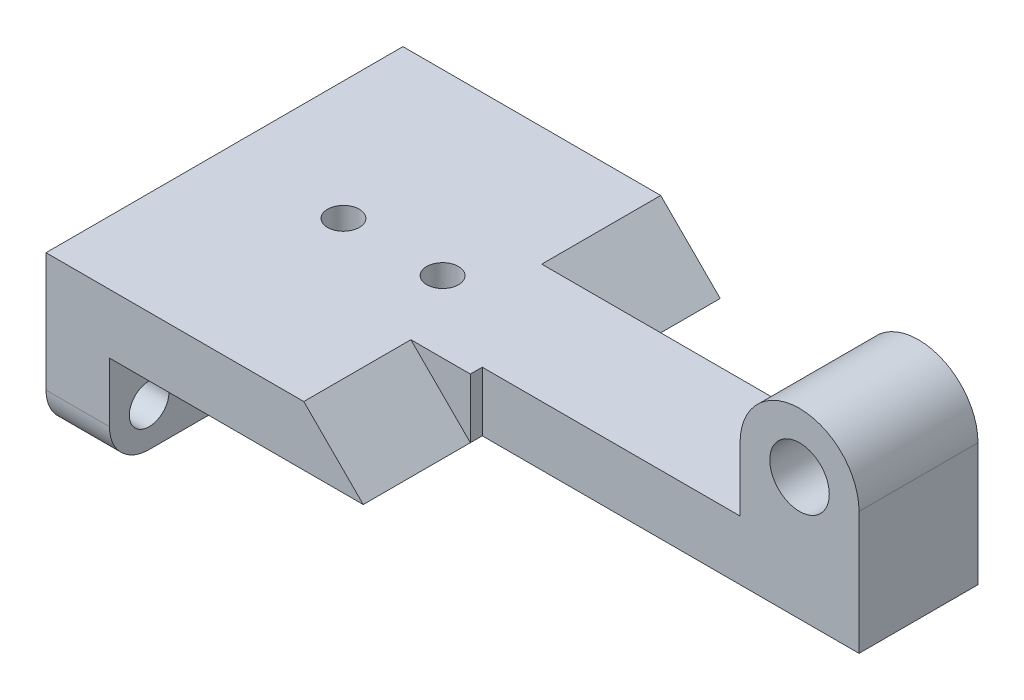
ISO-10303-21;
HEADER;
FILE_DESCRIPTION(('STEP AP214'),'2;1');
FILE_NAME('part.step','',(''),(''),'','','');
FILE_SCHEMA(('AUTOMOTIVE_DESIGN { 1 0 10303 214 1 1 1 1 }'));
ENDSEC;
DATA;
#1=APPLICATION_CONTEXT('core data for automotive mechanical design processes');
#2=APPLICATION_PROTOCOL_DEFINITION('international standard','automotive_design',2000,#1);
#3=PRODUCT_CONTEXT('',#1,'mechanical');
#4=PRODUCT('Part','Part','',(#3));
#5=PRODUCT_RELATED_PRODUCT_CATEGORY('part','',(#4));
#6=PRODUCT_DEFINITION_FORMATION('','',#4);
#7=PRODUCT_DEFINITION_CONTEXT('part definition',#1,'design');
#8=PRODUCT_DEFINITION('design','',#6,#7);
#9=PRODUCT_DEFINITION_SHAPE('','',#8);
#10=(LENGTH_UNIT() NAMED_UNIT(*) SI_UNIT(.MILLI.,.METRE.));
#11=(NAMED_UNIT(*) PLANE_ANGLE_UNIT() SI_UNIT($,.RADIAN.));
#12=(NAMED_UNIT(*) SI_UNIT($,.STERADIAN.) SOLID_ANGLE_UNIT());
#13=UNCERTAINTY_MEASURE_WITH_UNIT(LENGTH_MEASURE(1.E-05),#10,'distance_accuracy_value','');
#14=(GEOMETRIC_REPRESENTATION_CONTEXT(3) GLOBAL_UNCERTAINTY_ASSIGNED_CONTEXT((#13)) GLOBAL_UNIT_ASSIGNED_CONTEXT((#10,
#11,#12)) REPRESENTATION_CONTEXT('',''));
#15=CARTESIAN_POINT('',(0.,0.,0.));
#16=DIRECTION('',(0.,0.,1.));
#17=DIRECTION('',(1.,0.,0.));
#18=AXIS2_PLACEMENT_3D('',#15,#16,#17);
#19=CARTESIAN_POINT('',(0.,0.,45.));
#20=DIRECTION('',(1.,0.,0.));
#21=DIRECTION('',(0.,1.,0.));
#22=AXIS2_PLACEMENT_3D('',#19,#20,#21);
#23=PLANE('',#22);
#24=CARTESIAN_POINT('',(0.,-15.,-35.));
#25=DIRECTION('',(-1.,0.,0.));
#26=DIRECTION('',(0.,-1.,0.));
#27=AXIS2_PLACEMENT_3D('',#24,#25,#26);
#28=CIRCLE('',#27,5.);
#29=CARTESIAN_POINT('',(0.,-20.,-35.));
#30=VERTEX_POINT('',#29);
#31=EDGE_CURVE('E342',#30,#30,#28,.F.);
#32=ORIENTED_EDGE('',*,*,#31,.T.);
#33=EDGE_LOOP('',(#32));
#34=FACE_BOUND('',#33,.T.);
#35=CARTESIAN_POINT('',(0.,-15.,35.));
#36=DIRECTION('',(-1.,0.,0.));
#37=DIRECTION('',(0.,-1.,0.));
#38=AXIS2_PLACEMENT_3D('',#35,#36,#37);
#39=CIRCLE('',#38,5.);
#40=CARTESIAN_POINT('',(0.,-20.,35.));
#41=VERTEX_POINT('',#40);
#42=EDGE_CURVE('E338',#41,#41,#39,.T.);
#43=ORIENTED_EDGE('',*,*,#42,.F.);
#44=EDGE_LOOP('',(#43));
#45=FACE_BOUND('',#44,.T.);
#46=DIRECTION('',(0.,0.,-1.));
#47=VECTOR('',#46,1.);
#48=CARTESIAN_POINT('',(0.,-25.,45.));
#49=LINE('',#48,#47);
#50=CARTESIAN_POINT('',(0.,-25.,35.));
#51=VERTEX_POINT('',#50);
#52=CARTESIAN_POINT('',(0.,-25.,-35.));
#53=VERTEX_POINT('',#52);
#54=EDGE_CURVE('E187',#51,#53,#49,.T.);
#55=ORIENTED_EDGE('',*,*,#54,.F.);
#56=CARTESIAN_POINT('',(0.,-15.,35.));
#57=DIRECTION('',(-1.,0.,0.));
#58=DIRECTION('',(0.,-1.,0.));
#59=AXIS2_PLACEMENT_3D('',#56,#57,#58);
#60=CIRCLE('',#59,10.);
#61=CARTESIAN_POINT('',(0.,-15.,45.));
#62=VERTEX_POINT('',#61);
#63=EDGE_CURVE('E348',#51,#62,#60,.T.);
#64=ORIENTED_EDGE('',*,*,#63,.T.);
#65=DIRECTION('',(0.,-1.,0.));
#66=VECTOR('',#65,1.);
#67=CARTESIAN_POINT('',(0.,0.,45.));
#68=LINE('',#67,#66);
#69=CARTESIAN_POINT('',(0.,15.,45.));
#70=VERTEX_POINT('',#69);
#71=EDGE_CURVE('E317',#70,#62,#68,.T.);
#72=ORIENTED_EDGE('',*,*,#71,.F.);
#73=DIRECTION('',(0.,0.,-1.));
#74=VECTOR('',#73,1.);
#75=CARTESIAN_POINT('',(0.,15.,45.));
#76=LINE('',#75,#74);
#77=CARTESIAN_POINT('',(0.,15.,-45.));
#78=VERTEX_POINT('',#77);
#79=EDGE_CURVE('E198',#70,#78,#76,.T.);
#80=ORIENTED_EDGE('',*,*,#79,.T.);
#81=DIRECTION('',(0.,-1.,0.));
#82=VECTOR('',#81,1.);
#83=CARTESIAN_POINT('',(0.,0.,-45.));
#84=LINE('',#83,#82);
#85=CARTESIAN_POINT('',(0.,-15.,-45.));
#86=VERTEX_POINT('',#85);
#87=EDGE_CURVE('E307',#78,#86,#84,.T.);
#88=ORIENTED_EDGE('',*,*,#87,.T.);
#89=CARTESIAN_POINT('',(0.,-15.,-35.));
#90=DIRECTION('',(-1.,0.,0.));
#91=DIRECTION('',(0.,-1.,0.));
#92=AXIS2_PLACEMENT_3D('',#89,#90,#91);
#93=CIRCLE('',#92,10.);
#94=EDGE_CURVE('E86',#53,#86,#93,.F.);
#95=ORIENTED_EDGE('',*,*,#94,.F.);
#96=EDGE_LOOP('',(#55,#64,#72,#80,#88,#95));
#97=FACE_BOUND('',#96,.T.);
#98=ADVANCED_FACE('F62',(#34,#45,#97),#23,.F.);
#99=CARTESIAN_POINT('',(0.,-25.,45.));
#100=DIRECTION('',(0.,1.,0.));
#101=DIRECTION('',(0.,0.,1.));
#102=AXIS2_PLACEMENT_3D('',#99,#100,#101);
#103=PLANE('',#102);
#104=DIRECTION('',(0.,0.,-1.));
#105=VECTOR('',#104,1.);
#106=CARTESIAN_POINT('',(16.,-25.,45.));
#107=LINE('',#106,#105);
#108=CARTESIAN_POINT('',(16.,-25.,35.));
#109=VERTEX_POINT('',#108);
#110=CARTESIAN_POINT('',(16.,-25.,-35.));
#111=VERTEX_POINT('',#110);
#112=EDGE_CURVE('E190',#109,#111,#107,.T.);
#113=ORIENTED_EDGE('',*,*,#112,.F.);
#114=DIRECTION('',(-1.,0.,0.));
#115=VECTOR('',#114,1.);
#116=CARTESIAN_POINT('',(175.001,-25.,35.));
#117=LINE('',#116,#115);
#118=EDGE_CURVE('E346',#109,#51,#117,.T.);
#119=ORIENTED_EDGE('',*,*,#118,.T.);
#120=ORIENTED_EDGE('',*,*,#54,.T.);
#121=DIRECTION('',(-1.,0.,0.));
#122=VECTOR('',#121,1.);
#123=CARTESIAN_POINT('',(175.001,-25.,-35.));
#124=LINE('',#123,#122);
#125=EDGE_CURVE('E179',#111,#53,#124,.T.);
#126=ORIENTED_EDGE('',*,*,#125,.F.);
#127=EDGE_LOOP('',(#113,#119,#120,#126));
#128=FACE_BOUND('',#127,.T.);
#129=ADVANCED_FACE('F189',(#128),#103,.F.);
#130=CARTESIAN_POINT('',(16.,0.,45.));
#131=DIRECTION('',(-1.,0.,0.));
#132=DIRECTION('',(0.,0.,1.));
#133=AXIS2_PLACEMENT_3D('',#130,#131,#132);
#134=PLANE('',#133);
#135=CARTESIAN_POINT('',(16.,-15.,-35.));
#136=DIRECTION('',(-1.,0.,0.));
#137=DIRECTION('',(0.,0.,1.));
#138=AXIS2_PLACEMENT_3D('',#135,#136,#137);
#139=CIRCLE('',#138,5.);
#140=CARTESIAN_POINT('',(16.,-15.,-30.));
#141=VERTEX_POINT('',#140);
#142=EDGE_CURVE('E182',#141,#141,#139,.T.);
#143=ORIENTED_EDGE('',*,*,#142,.T.);
#144=EDGE_LOOP('',(#143));
#145=FACE_BOUND('',#144,.T.);
#146=CARTESIAN_POINT('',(16.,-15.,35.));
#147=DIRECTION('',(-1.,0.,0.));
#148=DIRECTION('',(0.,0.,1.));
#149=AXIS2_PLACEMENT_3D('',#146,#147,#148);
#150=CIRCLE('',#149,5.);
#151=CARTESIAN_POINT('',(16.,-15.,40.));
#152=VERTEX_POINT('',#151);
#153=EDGE_CURVE('E335',#152,#152,#150,.F.);
#154=ORIENTED_EDGE('',*,*,#153,.F.);
#155=EDGE_LOOP('',(#154));
#156=FACE_BOUND('',#155,.T.);
#157=DIRECTION('',(0.,1.,0.));
#158=VECTOR('',#157,1.);
#159=CARTESIAN_POINT('',(16.,0.,45.));
#160=LINE('',#159,#158);
#161=CARTESIAN_POINT('',(16.,-15.,45.));
#162=VERTEX_POINT('',#161);
#163=CARTESIAN_POINT('',(16.,0.,45.));
#164=VERTEX_POINT('',#163);
#165=EDGE_CURVE('E320',#162,#164,#160,.T.);
#166=ORIENTED_EDGE('',*,*,#165,.F.);
#167=CARTESIAN_POINT('',(16.,-15.,35.));
#168=DIRECTION('',(-1.,0.,0.));
#169=DIRECTION('',(0.,0.,1.));
#170=AXIS2_PLACEMENT_3D('',#167,#168,#169);
#171=CIRCLE('',#170,10.);
#172=EDGE_CURVE('E77',#162,#109,#171,.F.);
#173=ORIENTED_EDGE('',*,*,#172,.T.);
#174=ORIENTED_EDGE('',*,*,#112,.T.);
#175=CARTESIAN_POINT('',(16.,-15.,-35.));
#176=DIRECTION('',(-1.,0.,0.));
#177=DIRECTION('',(0.,0.,1.));
#178=AXIS2_PLACEMENT_3D('',#175,#176,#177);
#179=CIRCLE('',#178,10.);
#180=CARTESIAN_POINT('',(16.,-15.,-45.));
#181=VERTEX_POINT('',#180);
#182=EDGE_CURVE('E175',#181,#111,#179,.T.);
#183=ORIENTED_EDGE('',*,*,#182,.F.);
#184=DIRECTION('',(0.,1.,0.));
#185=VECTOR('',#184,1.);
#186=CARTESIAN_POINT('',(16.,0.,-45.));
#187=LINE('',#186,#185);
#188=CARTESIAN_POINT('',(16.,0.,-45.));
#189=VERTEX_POINT('',#188);
#190=EDGE_CURVE('E302',#181,#189,#187,.T.);
#191=ORIENTED_EDGE('',*,*,#190,.T.);
#192=DIRECTION('',(0.,0.,-1.));
#193=VECTOR('',#192,1.);
#194=CARTESIAN_POINT('',(16.,0.,45.));
#195=LINE('',#194,#193);
#196=EDGE_CURVE('E193',#164,#189,#195,.T.);
#197=ORIENTED_EDGE('',*,*,#196,.F.);
#198=EDGE_LOOP('',(#166,#173,#174,#183,#191,#197));
#199=FACE_BOUND('',#198,.T.);
#200=ADVANCED_FACE('F195',(#145,#156,#199),#134,.F.);
#201=CARTESIAN_POINT('',(175.,-1.5668470105597E-13,15.));
#202=DIRECTION('',(-1.,0.,0.));
#203=DIRECTION('',(0.,-1.,0.));
#204=AXIS2_PLACEMENT_3D('',#201,#202,#203);
#205=PLANE('',#204);
#206=DIRECTION('',(0.,1.,0.));
#207=VECTOR('',#206,1.);
#208=CARTESIAN_POINT('',(175.,-1.5668470105597E-13,-15.));
#209=LINE('',#208,#207);
#210=CARTESIAN_POINT('',(175.,0.,-15.));
#211=VERTEX_POINT('',#210);
#212=CARTESIAN_POINT('',(175.,31.,-15.));
#213=VERTEX_POINT('',#212);
#214=EDGE_CURVE('E246',#211,#213,#209,.T.);
#215=ORIENTED_EDGE('',*,*,#214,.T.);
#216=DIRECTION('',(0.,0.,-1.));
#217=VECTOR('',#216,1.);
#218=CARTESIAN_POINT('',(175.,31.,15.));
#219=LINE('',#218,#217);
#220=CARTESIAN_POINT('',(175.,31.,15.));
#221=VERTEX_POINT('',#220);
#222=EDGE_CURVE('E12',#221,#213,#219,.T.);
#223=ORIENTED_EDGE('',*,*,#222,.F.);
#224=DIRECTION('',(0.,1.,0.));
#225=VECTOR('',#224,1.);
#226=CARTESIAN_POINT('',(175.,-1.5668470105597E-13,15.));
#227=LINE('',#226,#225);
#228=CARTESIAN_POINT('',(175.,0.,15.));
#229=VERTEX_POINT('',#228);
#230=EDGE_CURVE('E228',#229,#221,#227,.T.);
#231=ORIENTED_EDGE('',*,*,#230,.F.);
#232=DIRECTION('',(0.,0.,-1.));
#233=VECTOR('',#232,1.);
#234=CARTESIAN_POINT('',(175.,0.,15.));
#235=LINE('',#234,#233);
#236=EDGE_CURVE('E243',#229,#211,#235,.T.);
#237=ORIENTED_EDGE('',*,*,#236,.T.);
#238=EDGE_LOOP('',(#215,#223,#231,#237));
#239=FACE_BOUND('',#238,.T.);
#240=ADVANCED_FACE('F412',(#239),#205,.F.);
#241=CARTESIAN_POINT('',(160.,31.,15.));
#242=DIRECTION('',(0.,0.,-1.));
#243=DIRECTION('',(-1.,0.,0.));
#244=AXIS2_PLACEMENT_3D('',#241,#242,#243);
#245=CYLINDRICAL_SURFACE('',#244,15.);
#246=CARTESIAN_POINT('',(160.,31.,-15.));
#247=DIRECTION('',(0.,0.,1.));
#248=DIRECTION('',(1.,0.,0.));
#249=AXIS2_PLACEMENT_3D('',#246,#247,#248);
#250=CIRCLE('',#249,15.);
#251=CARTESIAN_POINT('',(145.,31.,-15.));
#252=VERTEX_POINT('',#251);
#253=EDGE_CURVE('E247',#213,#252,#250,.T.);
#254=ORIENTED_EDGE('',*,*,#253,.T.);
#255=DIRECTION('',(0.,0.,-1.));
#256=VECTOR('',#255,1.);
#257=CARTESIAN_POINT('',(145.,31.,15.));
#258=LINE('',#257,#256);
#259=CARTESIAN_POINT('',(145.,31.,15.));
#260=VERTEX_POINT('',#259);
#261=EDGE_CURVE('E71',#260,#252,#258,.T.);
#262=ORIENTED_EDGE('',*,*,#261,.F.);
#263=CARTESIAN_POINT('',(160.,31.,15.));
#264=DIRECTION('',(0.,0.,1.));
#265=DIRECTION('',(1.,0.,0.));
#266=AXIS2_PLACEMENT_3D('',#263,#264,#265);
#267=CIRCLE('',#266,15.);
#268=EDGE_CURVE('E235',#221,#260,#267,.T.);
#269=ORIENTED_EDGE('',*,*,#268,.F.);
#270=ORIENTED_EDGE('',*,*,#222,.T.);
#271=EDGE_LOOP('',(#254,#262,#269,#270));
#272=FACE_BOUND('',#271,.T.);
#273=ADVANCED_FACE('F415',(#272),#245,.T.);
#274=CARTESIAN_POINT('',(145.,2.51534904016637E-13,15.));
#275=DIRECTION('',(1.,0.,0.));
#276=DIRECTION('',(0.,1.,0.));
#277=AXIS2_PLACEMENT_3D('',#274,#275,#276);
#278=PLANE('',#277);
#279=DIRECTION('',(0.,-1.,0.));
#280=VECTOR('',#279,1.);
#281=CARTESIAN_POINT('',(145.,2.51534904016637E-13,-15.));
#282=LINE('',#281,#280);
#283=CARTESIAN_POINT('',(145.,15.,-15.));
#284=VERTEX_POINT('',#283);
#285=EDGE_CURVE('E252',#252,#284,#282,.T.);
#286=ORIENTED_EDGE('',*,*,#285,.T.);
#287=DIRECTION('',(0.,0.,-1.));
#288=VECTOR('',#287,1.);
#289=CARTESIAN_POINT('',(145.,15.,15.));
#290=LINE('',#289,#288);
#291=CARTESIAN_POINT('',(145.,15.,15.));
#292=VERTEX_POINT('',#291);
#293=EDGE_CURVE('E259',#292,#284,#290,.T.);
#294=ORIENTED_EDGE('',*,*,#293,.F.);
#295=DIRECTION('',(0.,-1.,0.));
#296=VECTOR('',#295,1.);
#297=CARTESIAN_POINT('',(145.,2.51534904016637E-13,15.));
#298=LINE('',#297,#296);
#299=EDGE_CURVE('E232',#260,#292,#298,.T.);
#300=ORIENTED_EDGE('',*,*,#299,.F.);
#301=ORIENTED_EDGE('',*,*,#261,.T.);
#302=EDGE_LOOP('',(#286,#294,#300,#301));
#303=FACE_BOUND('',#302,.T.);
#304=ADVANCED_FACE('F266',(#303),#278,.F.);
#305=CARTESIAN_POINT('',(0.,15.,15.));
#306=DIRECTION('',(0.,-1.,0.));
#307=DIRECTION('',(1.,0.,0.));
#308=AXIS2_PLACEMENT_3D('',#305,#306,#307);
#309=PLANE('',#308);
#310=CARTESIAN_POINT('',(55.,15.,0.));
#311=DIRECTION('',(0.,1.,0.));
#312=DIRECTION('',(-1.,0.,0.));
#313=AXIS2_PLACEMENT_3D('',#310,#311,#312);
#314=CIRCLE('',#313,4.00000000000001);
#315=CARTESIAN_POINT('',(51.,15.,0.));
#316=VERTEX_POINT('',#315);
#317=EDGE_CURVE('E327',#316,#316,#314,.T.);
#318=ORIENTED_EDGE('',*,*,#317,.F.);
#319=EDGE_LOOP('',(#318));
#320=FACE_BOUND('',#319,.T.);
#321=CARTESIAN_POINT('',(30.,15.,0.));
#322=DIRECTION('',(0.,1.,0.));
#323=DIRECTION('',(-1.,0.,0.));
#324=AXIS2_PLACEMENT_3D('',#321,#322,#323);
#325=CIRCLE('',#324,4.00000000000001);
#326=CARTESIAN_POINT('',(26.,15.,0.));
#327=VERTEX_POINT('',#326);
#328=EDGE_CURVE('E324',#327,#327,#325,.T.);
#329=ORIENTED_EDGE('',*,*,#328,.F.);
#330=EDGE_LOOP('',(#329));
#331=FACE_BOUND('',#330,.T.);
#332=DIRECTION('',(-1.,0.,0.));
#333=VECTOR('',#332,1.);
#334=CARTESIAN_POINT('',(0.,15.,-15.));
#335=LINE('',#334,#333);
#336=CARTESIAN_POINT('',(64.9999999999998,15.,-15.));
#337=VERTEX_POINT('',#336);
#338=EDGE_CURVE('E255',#284,#337,#335,.T.);
#339=ORIENTED_EDGE('',*,*,#338,.T.);
#340=DIRECTION('',(0.,0.,-1.));
#341=VECTOR('',#340,1.);
#342=CARTESIAN_POINT('',(64.9999999999998,15.,45.));
#343=LINE('',#342,#341);
#344=CARTESIAN_POINT('',(64.9999999999998,15.,-45.));
#345=VERTEX_POINT('',#344);
#346=EDGE_CURVE('E202',#337,#345,#343,.T.);
#347=ORIENTED_EDGE('',*,*,#346,.T.);
#348=DIRECTION('',(-1.,0.,0.));
#349=VECTOR('',#348,1.);
#350=CARTESIAN_POINT('',(0.,15.,-45.));
#351=LINE('',#350,#349);
#352=EDGE_CURVE('E309',#345,#78,#351,.T.);
#353=ORIENTED_EDGE('',*,*,#352,.T.);
#354=ORIENTED_EDGE('',*,*,#79,.F.);
#355=DIRECTION('',(-1.,0.,0.));
#356=VECTOR('',#355,1.);
#357=CARTESIAN_POINT('',(0.,15.,45.));
#358=LINE('',#357,#356);
#359=CARTESIAN_POINT('',(64.9999999999998,15.,45.));
#360=VERTEX_POINT('',#359);
#361=EDGE_CURVE('E325',#360,#70,#358,.T.);
#362=ORIENTED_EDGE('',*,*,#361,.F.);
#363=CARTESIAN_POINT('',(64.9999999999998,15.,18.));
#364=VERTEX_POINT('',#363);
#365=EDGE_CURVE('E206',#360,#364,#343,.T.);
#366=ORIENTED_EDGE('',*,*,#365,.T.);
#367=DIRECTION('',(-1.,0.,0.));
#368=VECTOR('',#367,1.);
#369=CARTESIAN_POINT('',(0.,15.,18.));
#370=LINE('',#369,#368);
#371=CARTESIAN_POINT('',(80.,15.,18.));
#372=VERTEX_POINT('',#371);
#373=EDGE_CURVE('E214',#372,#364,#370,.T.);
#374=ORIENTED_EDGE('',*,*,#373,.F.);
#375=DIRECTION('',(0.,0.,1.));
#376=VECTOR('',#375,1.);
#377=CARTESIAN_POINT('',(80.,15.,-15.));
#378=LINE('',#377,#376);
#379=CARTESIAN_POINT('',(80.,15.,15.));
#380=VERTEX_POINT('',#379);
#381=EDGE_CURVE('E222',#380,#372,#378,.T.);
#382=ORIENTED_EDGE('',*,*,#381,.F.);
#383=DIRECTION('',(-1.,0.,0.));
#384=VECTOR('',#383,1.);
#385=CARTESIAN_POINT('',(0.,15.,15.));
#386=LINE('',#385,#384);
#387=EDGE_CURVE('E240',#292,#380,#386,.T.);
#388=ORIENTED_EDGE('',*,*,#387,.F.);
#389=ORIENTED_EDGE('',*,*,#293,.T.);
#390=EDGE_LOOP('',(#339,#347,#353,#354,#362,#366,#374,#382,#388,#389));
#391=FACE_BOUND('',#390,.T.);
#392=ADVANCED_FACE('F277',(#320,#331,#391),#309,.F.);
#393=CARTESIAN_POINT('',(160.,31.,15.));
#394=DIRECTION('',(0.,0.,-1.));
#395=DIRECTION('',(-1.,0.,0.));
#396=AXIS2_PLACEMENT_3D('',#393,#394,#395);
#397=CYLINDRICAL_SURFACE('',#396,7.50000000000001);
#398=CARTESIAN_POINT('',(160.,31.,15.));
#399=DIRECTION('',(0.,0.,1.));
#400=DIRECTION('',(1.,0.,0.));
#401=AXIS2_PLACEMENT_3D('',#398,#399,#400);
#402=CIRCLE('',#401,7.50000000000001);
#403=CARTESIAN_POINT('',(167.5,31.,15.));
#404=VERTEX_POINT('',#403);
#405=EDGE_CURVE('E229',#404,#404,#402,.T.);
#406=ORIENTED_EDGE('',*,*,#405,.T.);
#407=EDGE_LOOP('',(#406));
#408=FACE_BOUND('',#407,.T.);
#409=CARTESIAN_POINT('',(160.,31.,-15.));
#410=DIRECTION('',(0.,0.,1.));
#411=DIRECTION('',(1.,0.,0.));
#412=AXIS2_PLACEMENT_3D('',#409,#410,#411);
#413=CIRCLE('',#412,7.50000000000001);
#414=CARTESIAN_POINT('',(167.5,31.,-15.));
#415=VERTEX_POINT('',#414);
#416=EDGE_CURVE('E224',#415,#415,#413,.T.);
#417=ORIENTED_EDGE('',*,*,#416,.F.);
#418=EDGE_LOOP('',(#417));
#419=FACE_BOUND('',#418,.T.);
#420=ADVANCED_FACE('F66',(#408,#419),#397,.F.);
#421=CARTESIAN_POINT('',(0.,0.,15.));
#422=DIRECTION('',(0.,1.,0.));
#423=DIRECTION('',(0.,0.,1.));
#424=AXIS2_PLACEMENT_3D('',#421,#422,#423);
#425=PLANE('',#424);
#426=CARTESIAN_POINT('',(55.,0.,0.));
#427=DIRECTION('',(0.,1.,0.));
#428=DIRECTION('',(0.,0.,1.));
#429=AXIS2_PLACEMENT_3D('',#426,#427,#428);
#430=CIRCLE('',#429,4.00000000000001);
#431=CARTESIAN_POINT('',(51.,0.,0.));
#432=VERTEX_POINT('',#431);
#433=EDGE_CURVE('E312',#432,#432,#430,.F.);
#434=ORIENTED_EDGE('',*,*,#433,.F.);
#435=EDGE_LOOP('',(#434));
#436=FACE_BOUND('',#435,.T.);
#437=CARTESIAN_POINT('',(30.,0.,0.));
#438=DIRECTION('',(0.,1.,0.));
#439=DIRECTION('',(0.,0.,1.));
#440=AXIS2_PLACEMENT_3D('',#437,#438,#439);
#441=CIRCLE('',#440,4.00000000000001);
#442=CARTESIAN_POINT('',(26.,0.,0.));
#443=VERTEX_POINT('',#442);
#444=EDGE_CURVE('E328',#443,#443,#441,.F.);
#445=ORIENTED_EDGE('',*,*,#444,.F.);
#446=EDGE_LOOP('',(#445));
#447=FACE_BOUND('',#446,.T.);
#448=DIRECTION('',(1.,0.,0.));
#449=VECTOR('',#448,1.);
#450=CARTESIAN_POINT('',(0.,0.,-15.));
#451=LINE('',#450,#449);
#452=CARTESIAN_POINT('',(80.,0.,-15.));
#453=VERTEX_POINT('',#452);
#454=EDGE_CURVE('E227',#453,#211,#451,.T.);
#455=ORIENTED_EDGE('',*,*,#454,.T.);
#456=ORIENTED_EDGE('',*,*,#236,.F.);
#457=DIRECTION('',(1.,0.,0.));
#458=VECTOR('',#457,1.);
#459=CARTESIAN_POINT('',(0.,0.,15.));
#460=LINE('',#459,#458);
#461=CARTESIAN_POINT('',(80.,0.,15.));
#462=VERTEX_POINT('',#461);
#463=EDGE_CURVE('E241',#462,#229,#460,.T.);
#464=ORIENTED_EDGE('',*,*,#463,.F.);
#465=DIRECTION('',(0.,0.,1.));
#466=VECTOR('',#465,1.);
#467=CARTESIAN_POINT('',(80.,0.,-15.));
#468=LINE('',#467,#466);
#469=CARTESIAN_POINT('',(80.,0.,18.));
#470=VERTEX_POINT('',#469);
#471=EDGE_CURVE('E219',#462,#470,#468,.T.);
#472=ORIENTED_EDGE('',*,*,#471,.T.);
#473=DIRECTION('',(0.,0.,-1.));
#474=VECTOR('',#473,1.);
#475=CARTESIAN_POINT('',(80.,0.,45.));
#476=LINE('',#475,#474);
#477=CARTESIAN_POINT('',(80.,0.,45.));
#478=VERTEX_POINT('',#477);
#479=EDGE_CURVE('E200',#478,#470,#476,.T.);
#480=ORIENTED_EDGE('',*,*,#479,.F.);
#481=DIRECTION('',(1.,0.,0.));
#482=VECTOR('',#481,1.);
#483=CARTESIAN_POINT('',(0.,0.,45.));
#484=LINE('',#483,#482);
#485=EDGE_CURVE('E297',#164,#478,#484,.T.);
#486=ORIENTED_EDGE('',*,*,#485,.F.);
#487=ORIENTED_EDGE('',*,*,#196,.T.);
#488=DIRECTION('',(1.,0.,0.));
#489=VECTOR('',#488,1.);
#490=CARTESIAN_POINT('',(0.,0.,-45.));
#491=LINE('',#490,#489);
#492=CARTESIAN_POINT('',(80.,0.,-45.));
#493=VERTEX_POINT('',#492);
#494=EDGE_CURVE('E301',#189,#493,#491,.T.);
#495=ORIENTED_EDGE('',*,*,#494,.T.);
#496=EDGE_CURVE('E298',#453,#493,#476,.T.);
#497=ORIENTED_EDGE('',*,*,#496,.F.);
#498=EDGE_LOOP('',(#455,#456,#464,#472,#480,#486,#487,#495,#497));
#499=FACE_BOUND('',#498,.T.);
#500=ADVANCED_FACE('F287',(#436,#447,#499),#425,.F.);
#501=CARTESIAN_POINT('',(0.,0.,15.));
#502=DIRECTION('',(0.,0.,1.));
#503=DIRECTION('',(1.,0.,0.));
#504=AXIS2_PLACEMENT_3D('',#501,#502,#503);
#505=PLANE('',#504);
#506=ORIENTED_EDGE('',*,*,#405,.F.);
#507=EDGE_LOOP('',(#506));
#508=FACE_BOUND('',#507,.T.);
#509=ORIENTED_EDGE('',*,*,#230,.T.);
#510=ORIENTED_EDGE('',*,*,#268,.T.);
#511=ORIENTED_EDGE('',*,*,#299,.T.);
#512=ORIENTED_EDGE('',*,*,#387,.T.);
#513=DIRECTION('',(0.,1.,0.));
#514=VECTOR('',#513,1.);
#515=CARTESIAN_POINT('',(80.,0.,15.));
#516=LINE('',#515,#514);
#517=EDGE_CURVE('E239',#462,#380,#516,.T.);
#518=ORIENTED_EDGE('',*,*,#517,.F.);
#519=ORIENTED_EDGE('',*,*,#463,.T.);
#520=EDGE_LOOP('',(#509,#510,#511,#512,#518,#519));
#521=FACE_BOUND('',#520,.T.);
#522=ADVANCED_FACE('F285',(#508,#521),#505,.T.);
#523=CARTESIAN_POINT('',(0.,0.,-15.));
#524=DIRECTION('',(0.,0.,1.));
#525=DIRECTION('',(1.,0.,0.));
#526=AXIS2_PLACEMENT_3D('',#523,#524,#525);
#527=PLANE('',#526);
#528=ORIENTED_EDGE('',*,*,#416,.T.);
#529=EDGE_LOOP('',(#528));
#530=FACE_BOUND('',#529,.T.);
#531=ORIENTED_EDGE('',*,*,#214,.F.);
#532=ORIENTED_EDGE('',*,*,#454,.F.);
#533=DIRECTION('',(0.707106781186551,-0.707106781186544,0.));
#534=VECTOR('',#533,1.);
#535=CARTESIAN_POINT('',(39.9999999999996,40.,-15.));
#536=LINE('',#535,#534);
#537=EDGE_CURVE('E220',#337,#453,#536,.T.);
#538=ORIENTED_EDGE('',*,*,#537,.F.);
#539=ORIENTED_EDGE('',*,*,#338,.F.);
#540=ORIENTED_EDGE('',*,*,#285,.F.);
#541=ORIENTED_EDGE('',*,*,#253,.F.);
#542=EDGE_LOOP('',(#531,#532,#538,#539,#540,#541));
#543=FACE_BOUND('',#542,.T.);
#544=ADVANCED_FACE('F275',(#530,#543),#527,.F.);
#545=CARTESIAN_POINT('',(80.,0.,-15.));
#546=DIRECTION('',(1.,0.,0.));
#547=DIRECTION('',(0.,0.,-1.));
#548=AXIS2_PLACEMENT_3D('',#545,#546,#547);
#549=PLANE('',#548);
#550=ORIENTED_EDGE('',*,*,#471,.F.);
#551=ORIENTED_EDGE('',*,*,#517,.T.);
#552=ORIENTED_EDGE('',*,*,#381,.T.);
#553=DIRECTION('',(0.,1.,0.));
#554=VECTOR('',#553,1.);
#555=CARTESIAN_POINT('',(80.,0.,18.));
#556=LINE('',#555,#554);
#557=EDGE_CURVE('E215',#470,#372,#556,.T.);
#558=ORIENTED_EDGE('',*,*,#557,.F.);
#559=EDGE_LOOP('',(#550,#551,#552,#558));
#560=FACE_BOUND('',#559,.T.);
#561=ADVANCED_FACE('F289',(#560),#549,.T.);
#562=CARTESIAN_POINT('',(0.,0.,18.));
#563=DIRECTION('',(0.,0.,1.));
#564=DIRECTION('',(1.,0.,0.));
#565=AXIS2_PLACEMENT_3D('',#562,#563,#564);
#566=PLANE('',#565);
#567=DIRECTION('',(0.707106781186551,-0.707106781186544,0.));
#568=VECTOR('',#567,1.);
#569=CARTESIAN_POINT('',(39.9999999999996,40.,18.));
#570=LINE('',#569,#568);
#571=EDGE_CURVE('E207',#364,#470,#570,.T.);
#572=ORIENTED_EDGE('',*,*,#571,.T.);
#573=ORIENTED_EDGE('',*,*,#557,.T.);
#574=ORIENTED_EDGE('',*,*,#373,.T.);
#575=EDGE_LOOP('',(#572,#573,#574));
#576=FACE_BOUND('',#575,.T.);
#577=ADVANCED_FACE('F395',(#576),#566,.T.);
#578=CARTESIAN_POINT('',(39.9999999999996,40.,45.));
#579=DIRECTION('',(0.707106781186544,0.707106781186551,0.));
#580=DIRECTION('',(-0.707106781186551,0.707106781186544,0.));
#581=AXIS2_PLACEMENT_3D('',#578,#579,#580);
#582=PLANE('',#581);
#583=ORIENTED_EDGE('',*,*,#571,.F.);
#584=ORIENTED_EDGE('',*,*,#365,.F.);
#585=DIRECTION('',(0.707106781186551,-0.707106781186544,0.));
#586=VECTOR('',#585,1.);
#587=CARTESIAN_POINT('',(39.9999999999996,40.,45.));
#588=LINE('',#587,#586);
#589=EDGE_CURVE('E300',#360,#478,#588,.T.);
#590=ORIENTED_EDGE('',*,*,#589,.T.);
#591=ORIENTED_EDGE('',*,*,#479,.T.);
#592=EDGE_LOOP('',(#583,#584,#590,#591));
#593=FACE_BOUND('',#592,.T.);
#594=ADVANCED_FACE('F299',(#593),#582,.T.);
#595=ORIENTED_EDGE('',*,*,#346,.F.);
#596=ORIENTED_EDGE('',*,*,#537,.T.);
#597=ORIENTED_EDGE('',*,*,#496,.T.);
#598=DIRECTION('',(0.707106781186551,-0.707106781186544,0.));
#599=VECTOR('',#598,1.);
#600=CARTESIAN_POINT('',(39.9999999999996,40.,-45.));
#601=LINE('',#600,#599);
#602=EDGE_CURVE('E315',#345,#493,#601,.T.);
#603=ORIENTED_EDGE('',*,*,#602,.F.);
#604=EDGE_LOOP('',(#595,#596,#597,#603));
#605=FACE_BOUND('',#604,.T.);
#606=ADVANCED_FACE('F368',(#605),#582,.T.);
#607=CARTESIAN_POINT('',(0.,0.,45.));
#608=DIRECTION('',(0.,0.,1.));
#609=DIRECTION('',(1.,0.,0.));
#610=AXIS2_PLACEMENT_3D('',#607,#608,#609);
#611=PLANE('',#610);
#612=DIRECTION('',(-1.,0.,0.));
#613=VECTOR('',#612,1.);
#614=CARTESIAN_POINT('',(175.001,-15.,45.));
#615=LINE('',#614,#613);
#616=EDGE_CURVE('E341',#162,#62,#615,.T.);
#617=ORIENTED_EDGE('',*,*,#616,.F.);
#618=ORIENTED_EDGE('',*,*,#165,.T.);
#619=ORIENTED_EDGE('',*,*,#485,.T.);
#620=ORIENTED_EDGE('',*,*,#589,.F.);
#621=ORIENTED_EDGE('',*,*,#361,.T.);
#622=ORIENTED_EDGE('',*,*,#71,.T.);
#623=EDGE_LOOP('',(#617,#618,#619,#620,#621,#622));
#624=FACE_BOUND('',#623,.T.);
#625=ADVANCED_FACE('F367',(#624),#611,.T.);
#626=CARTESIAN_POINT('',(0.,0.,-45.));
#627=DIRECTION('',(0.,0.,1.));
#628=DIRECTION('',(1.,0.,0.));
#629=AXIS2_PLACEMENT_3D('',#626,#627,#628);
#630=PLANE('',#629);
#631=ORIENTED_EDGE('',*,*,#190,.F.);
#632=DIRECTION('',(-1.,0.,0.));
#633=VECTOR('',#632,1.);
#634=CARTESIAN_POINT('',(175.001,-15.,-45.));
#635=LINE('',#634,#633);
#636=EDGE_CURVE('E176',#181,#86,#635,.T.);
#637=ORIENTED_EDGE('',*,*,#636,.T.);
#638=ORIENTED_EDGE('',*,*,#87,.F.);
#639=ORIENTED_EDGE('',*,*,#352,.F.);
#640=ORIENTED_EDGE('',*,*,#602,.T.);
#641=ORIENTED_EDGE('',*,*,#494,.F.);
#642=EDGE_LOOP('',(#631,#637,#638,#639,#640,#641));
#643=FACE_BOUND('',#642,.T.);
#644=ADVANCED_FACE('F360',(#643),#630,.F.);
#645=CARTESIAN_POINT('',(30.,-25.001,0.));
#646=DIRECTION('',(0.,1.,0.));
#647=DIRECTION('',(-1.,0.,0.));
#648=AXIS2_PLACEMENT_3D('',#645,#646,#647);
#649=CYLINDRICAL_SURFACE('',#648,4.00000000000001);
#650=CARTESIAN_POINT('',(26.,15.,0.));
#651=CARTESIAN_POINT('',(26.,14.84375,0.));
#652=CARTESIAN_POINT('',(26.,14.6875,0.));
#653=CARTESIAN_POINT('',(26.,14.375,0.));
#654=CARTESIAN_POINT('',(26.,14.21875,0.));
#655=CARTESIAN_POINT('',(26.,13.90625,0.));
#656=CARTESIAN_POINT('',(26.,13.75,0.));
#657=CARTESIAN_POINT('',(26.,13.4375,0.));
#658=CARTESIAN_POINT('',(26.,13.28125,0.));
#659=CARTESIAN_POINT('',(26.,12.96875,0.));
#660=CARTESIAN_POINT('',(26.,12.8125,0.));
#661=CARTESIAN_POINT('',(26.,12.5,0.));
#662=CARTESIAN_POINT('',(26.,12.34375,0.));
#663=CARTESIAN_POINT('',(26.,12.03125,0.));
#664=CARTESIAN_POINT('',(26.,11.875,0.));
#665=CARTESIAN_POINT('',(26.,11.5625,0.));
#666=CARTESIAN_POINT('',(26.,11.40625,0.));
#667=CARTESIAN_POINT('',(26.,11.09375,0.));
#668=CARTESIAN_POINT('',(26.,10.9375,0.));
#669=CARTESIAN_POINT('',(26.,10.625,0.));
#670=CARTESIAN_POINT('',(26.,10.46875,0.));
#671=CARTESIAN_POINT('',(26.,10.15625,0.));
#672=CARTESIAN_POINT('',(26.,9.99999999999998,0.));
#673=CARTESIAN_POINT('',(26.,9.68749999999999,0.));
#674=CARTESIAN_POINT('',(26.,9.53124999999999,0.));
#675=CARTESIAN_POINT('',(26.,9.21874999999999,0.));
#676=CARTESIAN_POINT('',(26.,9.06249999999999,0.));
#677=CARTESIAN_POINT('',(26.,8.74999999999999,0.));
#678=CARTESIAN_POINT('',(26.,8.59374999999999,0.));
#679=CARTESIAN_POINT('',(26.,8.28124999999998,0.));
#680=CARTESIAN_POINT('',(26.,8.12499999999998,0.));
#681=CARTESIAN_POINT('',(26.,7.81249999999998,0.));
#682=CARTESIAN_POINT('',(26.,7.65624999999998,0.));
#683=CARTESIAN_POINT('',(26.,7.34374999999998,0.));
#684=CARTESIAN_POINT('',(26.,7.18749999999998,0.));
#685=CARTESIAN_POINT('',(26.,6.87499999999998,0.));
#686=CARTESIAN_POINT('',(26.,6.71874999999998,0.));
#687=CARTESIAN_POINT('',(26.,6.40624999999999,0.));
#688=CARTESIAN_POINT('',(26.,6.24999999999999,0.));
#689=CARTESIAN_POINT('',(26.,5.93749999999999,0.));
#690=CARTESIAN_POINT('',(26.,5.78124999999999,0.));
#691=CARTESIAN_POINT('',(26.,5.46874999999999,0.));
#692=CARTESIAN_POINT('',(26.,5.31249999999999,0.));
#693=CARTESIAN_POINT('',(26.,4.99999999999999,0.));
#694=CARTESIAN_POINT('',(26.,4.84374999999999,0.));
#695=CARTESIAN_POINT('',(26.,4.53124999999999,0.));
#696=CARTESIAN_POINT('',(26.,4.37499999999999,0.));
#697=CARTESIAN_POINT('',(26.,4.06249999999999,0.));
#698=CARTESIAN_POINT('',(26.,3.90624999999999,0.));
#699=CARTESIAN_POINT('',(26.,3.59374999999999,0.));
#700=CARTESIAN_POINT('',(26.,3.43749999999999,0.));
#701=CARTESIAN_POINT('',(26.,3.12499999999999,0.));
#702=CARTESIAN_POINT('',(26.,2.96874999999999,0.));
#703=CARTESIAN_POINT('',(26.,2.65624999999999,0.));
#704=CARTESIAN_POINT('',(26.,2.49999999999999,0.));
#705=CARTESIAN_POINT('',(26.,2.1875,0.));
#706=CARTESIAN_POINT('',(26.,2.03124999999999,0.));
#707=CARTESIAN_POINT('',(26.,1.71874999999999,0.));
#708=CARTESIAN_POINT('',(26.,1.56249999999999,0.));
#709=CARTESIAN_POINT('',(26.,1.25,0.));
#710=CARTESIAN_POINT('',(26.,1.09375,0.));
#711=CARTESIAN_POINT('',(26.,0.781249999999997,0.));
#712=CARTESIAN_POINT('',(26.,0.624999999999997,0.));
#713=CARTESIAN_POINT('',(26.,0.312499999999997,0.));
#714=CARTESIAN_POINT('',(26.,0.156249999999997,0.));
#715=CARTESIAN_POINT('',(26.,0.,0.));
#716=B_SPLINE_CURVE_WITH_KNOTS('',3,(#650,#651,#652,#653,#654,#655,#656,#657,#658,#659,#660,
#661,#662,#663,#664,#665,#666,#667,#668,#669,#670,#671,#672,#673,#674,#675,#676,#677,#678,#679,
#680,#681,#682,#683,#684,#685,#686,#687,#688,#689,#690,#691,#692,#693,#694,#695,#696,#697,#698,
#699,#700,#701,#702,#703,#704,#705,#706,#707,#708,#709,#710,#711,#712,#713,#714,#715),
.UNSPECIFIED.,.F.,.F.,(4,2,2,2,2,2,2,2,2,2,2,2,2,2,2,2,2,2,2,2,2,2,2,2,2,2,2,2,2,2,2,2,4),(0.,
0.468749999999997,0.937500000000001,1.40625,1.875,2.34375,2.8125,3.28125,3.75,4.21874999999999,
4.6875,5.15624999999999,5.62499999999999,6.09374999999999,6.56249999999999,7.03125,
7.49999999999999,7.96875,8.43749999999999,8.90624999999999,9.37499999999999,9.84374999999999,
10.3125,10.78125,11.25,11.71875,12.1875,12.65625,13.125,13.59375,14.0625,14.53125,15.),.UNSPECIFIED.);
#717=EDGE_CURVE('BSEAM431',#327,#443,#716,.T.);
#718=ORIENTED_EDGE('',*,*,#328,.T.);
#719=ORIENTED_EDGE('',*,*,#444,.T.);
#720=ORIENTED_EDGE('',*,*,#717,.T.);
#721=ORIENTED_EDGE('',*,*,#717,.F.);
#722=EDGE_LOOP('',(#718,#720,#719,#721));
#723=FACE_BOUND('',#722,.T.);
#724=ADVANCED_FACE('F431',(#723),#649,.F.);
#725=CARTESIAN_POINT('',(55.,-25.001,0.));
#726=DIRECTION('',(0.,1.,0.));
#727=DIRECTION('',(-1.,0.,0.));
#728=AXIS2_PLACEMENT_3D('',#725,#726,#727);
#729=CYLINDRICAL_SURFACE('',#728,4.00000000000001);
#730=CARTESIAN_POINT('',(51.,15.,0.));
#731=CARTESIAN_POINT('',(51.,14.84375,0.));
#732=CARTESIAN_POINT('',(51.,14.6875,0.));
#733=CARTESIAN_POINT('',(51.,14.375,0.));
#734=CARTESIAN_POINT('',(51.,14.21875,0.));
#735=CARTESIAN_POINT('',(51.,13.90625,0.));
#736=CARTESIAN_POINT('',(51.,13.75,0.));
#737=CARTESIAN_POINT('',(51.,13.4375,0.));
#738=CARTESIAN_POINT('',(51.,13.28125,0.));
#739=CARTESIAN_POINT('',(51.,12.96875,0.));
#740=CARTESIAN_POINT('',(51.,12.8125,0.));
#741=CARTESIAN_POINT('',(51.,12.5,0.));
#742=CARTESIAN_POINT('',(51.,12.34375,0.));
#743=CARTESIAN_POINT('',(51.,12.03125,0.));
#744=CARTESIAN_POINT('',(51.,11.875,0.));
#745=CARTESIAN_POINT('',(51.,11.5625,0.));
#746=CARTESIAN_POINT('',(51.,11.40625,0.));
#747=CARTESIAN_POINT('',(51.,11.09375,0.));
#748=CARTESIAN_POINT('',(51.,10.9375,0.));
#749=CARTESIAN_POINT('',(51.,10.625,0.));
#750=CARTESIAN_POINT('',(51.,10.46875,0.));
#751=CARTESIAN_POINT('',(51.,10.15625,0.));
#752=CARTESIAN_POINT('',(51.,9.99999999999999,0.));
#753=CARTESIAN_POINT('',(51.,9.68749999999999,0.));
#754=CARTESIAN_POINT('',(51.,9.53124999999999,0.));
#755=CARTESIAN_POINT('',(51.,9.21874999999999,0.));
#756=CARTESIAN_POINT('',(51.,9.06249999999999,0.));
#757=CARTESIAN_POINT('',(51.,8.74999999999999,0.));
#758=CARTESIAN_POINT('',(51.,8.59374999999999,0.));
#759=CARTESIAN_POINT('',(51.,8.28124999999999,0.));
#760=CARTESIAN_POINT('',(51.,8.12499999999999,0.));
#761=CARTESIAN_POINT('',(51.,7.81249999999999,0.));
#762=CARTESIAN_POINT('',(51.,7.65624999999999,0.));
#763=CARTESIAN_POINT('',(51.,7.34374999999999,0.));
#764=CARTESIAN_POINT('',(51.,7.18749999999999,0.));
#765=CARTESIAN_POINT('',(51.,6.87499999999999,0.));
#766=CARTESIAN_POINT('',(51.,6.71874999999999,0.));
#767=CARTESIAN_POINT('',(51.,6.40624999999999,0.));
#768=CARTESIAN_POINT('',(51.,6.25,0.));
#769=CARTESIAN_POINT('',(51.,5.9375,0.));
#770=CARTESIAN_POINT('',(51.,5.78125,0.));
#771=CARTESIAN_POINT('',(51.,5.46875,0.));
#772=CARTESIAN_POINT('',(51.,5.3125,0.));
#773=CARTESIAN_POINT('',(51.,5.,0.));
#774=CARTESIAN_POINT('',(51.,4.84375,0.));
#775=CARTESIAN_POINT('',(51.,4.53125,0.));
#776=CARTESIAN_POINT('',(51.,4.375,0.));
#777=CARTESIAN_POINT('',(51.,4.0625,0.));
#778=CARTESIAN_POINT('',(51.,3.90625,0.));
#779=CARTESIAN_POINT('',(51.,3.59375,0.));
#780=CARTESIAN_POINT('',(51.,3.4375,0.));
#781=CARTESIAN_POINT('',(51.,3.125,0.));
#782=CARTESIAN_POINT('',(51.,2.96875,0.));
#783=CARTESIAN_POINT('',(51.,2.65625,0.));
#784=CARTESIAN_POINT('',(51.,2.5,0.));
#785=CARTESIAN_POINT('',(51.,2.1875,0.));
#786=CARTESIAN_POINT('',(51.,2.03125,0.));
#787=CARTESIAN_POINT('',(51.,1.71875,0.));
#788=CARTESIAN_POINT('',(51.,1.5625,0.));
#789=CARTESIAN_POINT('',(51.,1.25,0.));
#790=CARTESIAN_POINT('',(51.,1.09375,0.));
#791=CARTESIAN_POINT('',(51.,0.781249999999997,0.));
#792=CARTESIAN_POINT('',(51.,0.624999999999997,0.));
#793=CARTESIAN_POINT('',(51.,0.312499999999997,0.));
#794=CARTESIAN_POINT('',(51.,0.156249999999997,0.));
#795=CARTESIAN_POINT('',(51.,0.,0.));
#796=B_SPLINE_CURVE_WITH_KNOTS('',3,(#730,#731,#732,#733,#734,#735,#736,#737,#738,#739,#740,
#741,#742,#743,#744,#745,#746,#747,#748,#749,#750,#751,#752,#753,#754,#755,#756,#757,#758,#759,
#760,#761,#762,#763,#764,#765,#766,#767,#768,#769,#770,#771,#772,#773,#774,#775,#776,#777,#778,
#779,#780,#781,#782,#783,#784,#785,#786,#787,#788,#789,#790,#791,#792,#793,#794,#795),
.UNSPECIFIED.,.F.,.F.,(4,2,2,2,2,2,2,2,2,2,2,2,2,2,2,2,2,2,2,2,2,2,2,2,2,2,2,2,2,2,2,2,4),(0.,
0.468749999999997,0.937500000000001,1.40625,1.875,2.34375,2.8125,3.28125,3.75,4.21875,4.6875,
5.15625,5.625,6.09375,6.5625,7.03125,7.5,7.96875,8.4375,8.90624999999999,9.375,9.84374999999999,
10.3125,10.78125,11.25,11.71875,12.1875,12.65625,13.125,13.59375,14.0625,14.53125,15.),.UNSPECIFIED.);
#797=EDGE_CURVE('BSEAM434',#316,#432,#796,.T.);
#798=ORIENTED_EDGE('',*,*,#317,.T.);
#799=ORIENTED_EDGE('',*,*,#433,.T.);
#800=ORIENTED_EDGE('',*,*,#797,.T.);
#801=ORIENTED_EDGE('',*,*,#797,.F.);
#802=EDGE_LOOP('',(#798,#800,#799,#801));
#803=FACE_BOUND('',#802,.T.);
#804=ADVANCED_FACE('F434',(#803),#729,.F.);
#805=CARTESIAN_POINT('',(175.001,-15.,35.));
#806=DIRECTION('',(-1.,0.,0.));
#807=DIRECTION('',(0.,-1.,0.));
#808=AXIS2_PLACEMENT_3D('',#805,#806,#807);
#809=CYLINDRICAL_SURFACE('',#808,5.);
#810=ORIENTED_EDGE('',*,*,#42,.T.);
#811=EDGE_LOOP('',(#810));
#812=FACE_BOUND('',#811,.T.);
#813=ORIENTED_EDGE('',*,*,#153,.T.);
#814=EDGE_LOOP('',(#813));
#815=FACE_BOUND('',#814,.T.);
#816=ADVANCED_FACE('F437',(#812,#815),#809,.F.);
#817=CARTESIAN_POINT('',(175.001,-15.,-35.));
#818=DIRECTION('',(-1.,0.,0.));
#819=DIRECTION('',(0.,-1.,0.));
#820=AXIS2_PLACEMENT_3D('',#817,#818,#819);
#821=CYLINDRICAL_SURFACE('',#820,5.);
#822=ORIENTED_EDGE('',*,*,#31,.F.);
#823=EDGE_LOOP('',(#822));
#824=FACE_BOUND('',#823,.T.);
#825=ORIENTED_EDGE('',*,*,#142,.F.);
#826=EDGE_LOOP('',(#825));
#827=FACE_BOUND('',#826,.T.);
#828=ADVANCED_FACE('F380',(#824,#827),#821,.F.);
#829=CARTESIAN_POINT('',(175.001,-15.,-35.));
#830=DIRECTION('',(-1.,0.,0.));
#831=DIRECTION('',(0.,-1.,0.));
#832=AXIS2_PLACEMENT_3D('',#829,#830,#831);
#833=CYLINDRICAL_SURFACE('',#832,10.);
#834=ORIENTED_EDGE('',*,*,#182,.T.);
#835=ORIENTED_EDGE('',*,*,#125,.T.);
#836=ORIENTED_EDGE('',*,*,#94,.T.);
#837=ORIENTED_EDGE('',*,*,#636,.F.);
#838=EDGE_LOOP('',(#834,#835,#836,#837));
#839=FACE_BOUND('',#838,.T.);
#840=ADVANCED_FACE('F172',(#839),#833,.T.);
#841=CARTESIAN_POINT('',(175.001,-15.,35.));
#842=DIRECTION('',(-1.,0.,0.));
#843=DIRECTION('',(0.,-1.,0.));
#844=AXIS2_PLACEMENT_3D('',#841,#842,#843);
#845=CYLINDRICAL_SURFACE('',#844,10.);
#846=ORIENTED_EDGE('',*,*,#616,.T.);
#847=ORIENTED_EDGE('',*,*,#63,.F.);
#848=ORIENTED_EDGE('',*,*,#118,.F.);
#849=ORIENTED_EDGE('',*,*,#172,.F.);
#850=EDGE_LOOP('',(#846,#847,#848,#849));
#851=FACE_BOUND('',#850,.T.);
#852=ADVANCED_FACE('F371',(#851),#845,.T.);
#853=CLOSED_SHELL('',(#98,#129,#200,#240,#273,#304,#392,#420,#500,#522,#544,#561,#577,#594,#606,
#625,#644,#724,#804,#816,#828,#840,#852));
#854=MANIFOLD_SOLID_BREP('B2',#853);
#855=ADVANCED_BREP_SHAPE_REPRESENTATION('',(#18,#854),#14);
#856=SHAPE_DEFINITION_REPRESENTATION(#9,#855);
ENDSEC;
END-ISO-10303-21;
